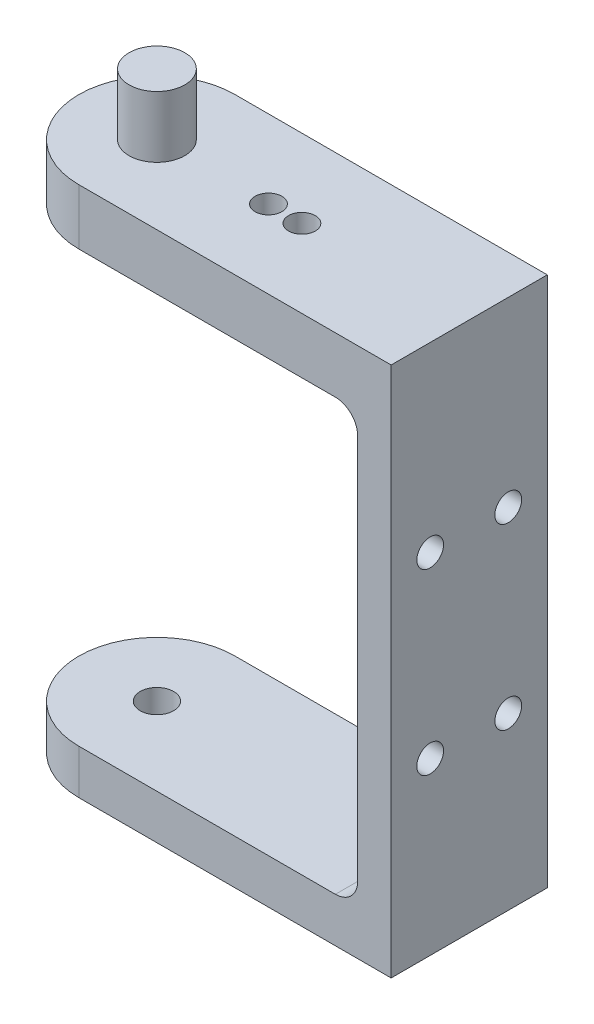
ISO-10303-21;
HEADER;
FILE_DESCRIPTION(('STEP AP214'),'2;1');
FILE_NAME('part.step','',(''),(''),'','','');
FILE_SCHEMA(('AUTOMOTIVE_DESIGN { 1 0 10303 214 1 1 1 1 }'));
ENDSEC;
DATA;
#1=APPLICATION_CONTEXT('core data for automotive mechanical design processes');
#2=APPLICATION_PROTOCOL_DEFINITION('international standard','automotive_design',2000,#1);
#3=PRODUCT_CONTEXT('',#1,'mechanical');
#4=PRODUCT('Part','Part','',(#3));
#5=PRODUCT_RELATED_PRODUCT_CATEGORY('part','',(#4));
#6=PRODUCT_DEFINITION_FORMATION('','',#4);
#7=PRODUCT_DEFINITION_CONTEXT('part definition',#1,'design');
#8=PRODUCT_DEFINITION('design','',#6,#7);
#9=PRODUCT_DEFINITION_SHAPE('','',#8);
#10=(LENGTH_UNIT() NAMED_UNIT(*) SI_UNIT(.MILLI.,.METRE.));
#11=(NAMED_UNIT(*) PLANE_ANGLE_UNIT() SI_UNIT($,.RADIAN.));
#12=(NAMED_UNIT(*) SI_UNIT($,.STERADIAN.) SOLID_ANGLE_UNIT());
#13=UNCERTAINTY_MEASURE_WITH_UNIT(LENGTH_MEASURE(1.E-05),#10,'distance_accuracy_value','');
#14=(GEOMETRIC_REPRESENTATION_CONTEXT(3) GLOBAL_UNCERTAINTY_ASSIGNED_CONTEXT((#13)) GLOBAL_UNIT_ASSIGNED_CONTEXT((#10,
#11,#12)) REPRESENTATION_CONTEXT('',''));
#15=CARTESIAN_POINT('',(0.,0.,0.));
#16=DIRECTION('',(0.,0.,1.));
#17=DIRECTION('',(1.,0.,0.));
#18=AXIS2_PLACEMENT_3D('',#15,#16,#17);
#19=CARTESIAN_POINT('',(5.5,19.3,0.));
#20=DIRECTION('',(0.,1.,0.));
#21=DIRECTION('',(0.,0.,1.));
#22=AXIS2_PLACEMENT_3D('',#19,#20,#21);
#23=PLANE('',#22);
#24=DIRECTION('',(-1.,0.,0.));
#25=VECTOR('',#24,1.);
#26=CARTESIAN_POINT('',(33.5,19.3,-7.));
#27=LINE('',#26,#25);
#28=CARTESIAN_POINT('',(28.5,19.3,-7.));
#29=VERTEX_POINT('',#28);
#30=CARTESIAN_POINT('',(5.5,19.3,-7.));
#31=VERTEX_POINT('',#30);
#32=EDGE_CURVE('E252',#29,#31,#27,.T.);
#33=ORIENTED_EDGE('',*,*,#32,.F.);
#34=DIRECTION('',(0.,0.,-1.));
#35=VECTOR('',#34,1.);
#36=CARTESIAN_POINT('',(28.5,19.3,7.));
#37=LINE('',#36,#35);
#38=CARTESIAN_POINT('',(28.5,19.3,7.));
#39=VERTEX_POINT('',#38);
#40=EDGE_CURVE('E61',#29,#39,#37,.F.);
#41=ORIENTED_EDGE('',*,*,#40,.T.);
#42=DIRECTION('',(1.,0.,0.));
#43=VECTOR('',#42,1.);
#44=CARTESIAN_POINT('',(5.5,19.3,7.));
#45=LINE('',#44,#43);
#46=CARTESIAN_POINT('',(5.5,19.3,7.));
#47=VERTEX_POINT('',#46);
#48=EDGE_CURVE('E265',#47,#39,#45,.T.);
#49=ORIENTED_EDGE('',*,*,#48,.F.);
#50=CARTESIAN_POINT('',(5.5,19.3,0.));
#51=DIRECTION('',(0.,1.,0.));
#52=DIRECTION('',(0.,0.,1.));
#53=AXIS2_PLACEMENT_3D('',#50,#51,#52);
#54=CIRCLE('',#53,7.);
#55=EDGE_CURVE('E246',#31,#47,#54,.T.);
#56=ORIENTED_EDGE('',*,*,#55,.F.);
#57=EDGE_LOOP('',(#33,#41,#49,#56));
#58=FACE_BOUND('',#57,.T.);
#59=DIRECTION('',(1.,0.,0.));
#60=VECTOR('',#59,1.);
#61=CARTESIAN_POINT('',(5.5,19.3,2.7));
#62=LINE('',#61,#60);
#63=CARTESIAN_POINT('',(8.0298221281347,19.3,2.7));
#64=VERTEX_POINT('',#63);
#65=CARTESIAN_POINT('',(20.7,19.3,2.7));
#66=VERTEX_POINT('',#65);
#67=EDGE_CURVE('E172',#64,#66,#62,.T.);
#68=ORIENTED_EDGE('',*,*,#67,.T.);
#69=DIRECTION('',(0.,0.,-1.));
#70=VECTOR('',#69,1.);
#71=CARTESIAN_POINT('',(20.7,19.3,2.7));
#72=LINE('',#71,#70);
#73=CARTESIAN_POINT('',(20.7,19.3,-2.7));
#74=VERTEX_POINT('',#73);
#75=EDGE_CURVE('E157',#66,#74,#72,.T.);
#76=ORIENTED_EDGE('',*,*,#75,.T.);
#77=DIRECTION('',(-1.,0.,0.));
#78=VECTOR('',#77,1.);
#79=CARTESIAN_POINT('',(20.7,19.3,-2.7));
#80=LINE('',#79,#78);
#81=CARTESIAN_POINT('',(8.0298221281347,19.3,-2.7));
#82=VERTEX_POINT('',#81);
#83=EDGE_CURVE('E151',#74,#82,#80,.T.);
#84=ORIENTED_EDGE('',*,*,#83,.T.);
#85=CARTESIAN_POINT('',(5.5,19.3,0.));
#86=DIRECTION('',(0.,1.,0.));
#87=DIRECTION('',(0.,0.,1.));
#88=AXIS2_PLACEMENT_3D('',#85,#86,#87);
#89=CIRCLE('',#88,3.7);
#90=EDGE_CURVE('E188',#82,#64,#89,.T.);
#91=ORIENTED_EDGE('',*,*,#90,.T.);
#92=EDGE_LOOP('',(#68,#76,#84,#91));
#93=FACE_BOUND('',#92,.T.);
#94=ADVANCED_FACE('F39',(#58,#93),#23,.F.);
#95=CARTESIAN_POINT('',(5.5,20.9,0.));
#96=DIRECTION('',(0.,-1.,0.));
#97=DIRECTION('',(0.,0.,-1.));
#98=AXIS2_PLACEMENT_3D('',#95,#96,#97);
#99=CYLINDRICAL_SURFACE('',#98,3.7);
#100=CARTESIAN_POINT('',(5.5,20.9,0.));
#101=DIRECTION('',(0.,1.,0.));
#102=DIRECTION('',(0.,0.,1.));
#103=AXIS2_PLACEMENT_3D('',#100,#101,#102);
#104=CIRCLE('',#103,3.7);
#105=CARTESIAN_POINT('',(8.02982212813471,20.9,-2.7));
#106=VERTEX_POINT('',#105);
#107=CARTESIAN_POINT('',(8.0298221281347,20.9,2.7));
#108=VERTEX_POINT('',#107);
#109=EDGE_CURVE('E189',#106,#108,#104,.T.);
#110=ORIENTED_EDGE('',*,*,#109,.T.);
#111=DIRECTION('',(0.,-1.,0.));
#112=VECTOR('',#111,1.);
#113=CARTESIAN_POINT('',(8.02982212813471,20.9,2.7));
#114=LINE('',#113,#112);
#115=EDGE_CURVE('E144',#108,#64,#114,.T.);
#116=ORIENTED_EDGE('',*,*,#115,.T.);
#117=ORIENTED_EDGE('',*,*,#90,.F.);
#118=DIRECTION('',(0.,-1.,0.));
#119=VECTOR('',#118,1.);
#120=CARTESIAN_POINT('',(8.02982212813471,20.9,-2.7));
#121=LINE('',#120,#119);
#122=EDGE_CURVE('E160',#82,#106,#121,.F.);
#123=ORIENTED_EDGE('',*,*,#122,.T.);
#124=EDGE_LOOP('',(#110,#116,#117,#123));
#125=FACE_BOUND('',#124,.T.);
#126=ADVANCED_FACE('F361',(#125),#99,.F.);
#127=CARTESIAN_POINT('',(5.5,24.3,0.));
#128=DIRECTION('',(0.,-1.,0.));
#129=DIRECTION('',(0.,0.,-1.));
#130=AXIS2_PLACEMENT_3D('',#127,#128,#129);
#131=CYLINDRICAL_SURFACE('',#130,7.);
#132=ORIENTED_EDGE('',*,*,#55,.T.);
#133=DIRECTION('',(0.,-1.,0.));
#134=VECTOR('',#133,1.);
#135=CARTESIAN_POINT('',(5.5,24.3,7.));
#136=LINE('',#135,#134);
#137=CARTESIAN_POINT('',(5.5,24.3,7.));
#138=VERTEX_POINT('',#137);
#139=EDGE_CURVE('E279',#138,#47,#136,.T.);
#140=ORIENTED_EDGE('',*,*,#139,.F.);
#141=CARTESIAN_POINT('',(5.5,24.3,0.));
#142=DIRECTION('',(0.,1.,0.));
#143=DIRECTION('',(0.,0.,1.));
#144=AXIS2_PLACEMENT_3D('',#141,#142,#143);
#145=CIRCLE('',#144,7.);
#146=CARTESIAN_POINT('',(5.5,24.3,-7.));
#147=VERTEX_POINT('',#146);
#148=EDGE_CURVE('E247',#147,#138,#145,.T.);
#149=ORIENTED_EDGE('',*,*,#148,.F.);
#150=DIRECTION('',(0.,-1.,0.));
#151=VECTOR('',#150,1.);
#152=CARTESIAN_POINT('',(5.5,24.3,-7.));
#153=LINE('',#152,#151);
#154=EDGE_CURVE('E261',#147,#31,#153,.T.);
#155=ORIENTED_EDGE('',*,*,#154,.T.);
#156=EDGE_LOOP('',(#132,#140,#149,#155));
#157=FACE_BOUND('',#156,.T.);
#158=ADVANCED_FACE('F352',(#157),#131,.T.);
#159=CARTESIAN_POINT('',(5.5,24.3,7.));
#160=DIRECTION('',(0.,0.,-1.));
#161=DIRECTION('',(-1.,0.,0.));
#162=AXIS2_PLACEMENT_3D('',#159,#160,#161);
#163=PLANE('',#162);
#164=ORIENTED_EDGE('',*,*,#48,.T.);
#165=CARTESIAN_POINT('',(28.5,17.3,7.));
#166=DIRECTION('',(0.,0.,-1.));
#167=DIRECTION('',(-1.,0.,0.));
#168=AXIS2_PLACEMENT_3D('',#165,#166,#167);
#169=CIRCLE('',#168,2.);
#170=CARTESIAN_POINT('',(30.5,17.3,7.));
#171=VERTEX_POINT('',#170);
#172=EDGE_CURVE('E11',#39,#171,#169,.T.);
#173=ORIENTED_EDGE('',*,*,#172,.T.);
#174=DIRECTION('',(0.,-1.,0.));
#175=VECTOR('',#174,1.);
#176=CARTESIAN_POINT('',(30.5,-23.3,7.));
#177=LINE('',#176,#175);
#178=CARTESIAN_POINT('',(30.5,-17.3,7.));
#179=VERTEX_POINT('',#178);
#180=EDGE_CURVE('E227',#171,#179,#177,.T.);
#181=ORIENTED_EDGE('',*,*,#180,.T.);
#182=CARTESIAN_POINT('',(28.5,-17.3,7.));
#183=DIRECTION('',(0.,0.,-1.));
#184=DIRECTION('',(-1.,0.,0.));
#185=AXIS2_PLACEMENT_3D('',#182,#183,#184);
#186=CIRCLE('',#185,2.);
#187=CARTESIAN_POINT('',(28.5,-19.3,7.));
#188=VERTEX_POINT('',#187);
#189=EDGE_CURVE('E308',#179,#188,#186,.T.);
#190=ORIENTED_EDGE('',*,*,#189,.T.);
#191=DIRECTION('',(1.,0.,0.));
#192=VECTOR('',#191,1.);
#193=CARTESIAN_POINT('',(5.5,-19.3,7.));
#194=LINE('',#193,#192);
#195=CARTESIAN_POINT('',(5.5,-19.3,7.));
#196=VERTEX_POINT('',#195);
#197=EDGE_CURVE('E208',#196,#188,#194,.T.);
#198=ORIENTED_EDGE('',*,*,#197,.F.);
#199=DIRECTION('',(0.,-1.,0.));
#200=VECTOR('',#199,1.);
#201=CARTESIAN_POINT('',(5.5,-19.3,7.));
#202=LINE('',#201,#200);
#203=CARTESIAN_POINT('',(5.5,-23.3,7.));
#204=VERTEX_POINT('',#203);
#205=EDGE_CURVE('E222',#196,#204,#202,.T.);
#206=ORIENTED_EDGE('',*,*,#205,.T.);
#207=DIRECTION('',(1.,0.,0.));
#208=VECTOR('',#207,1.);
#209=CARTESIAN_POINT('',(30.5,-23.3,7.));
#210=LINE('',#209,#208);
#211=CARTESIAN_POINT('',(33.5,-23.3,7.));
#212=VERTEX_POINT('',#211);
#213=EDGE_CURVE('E231',#204,#212,#210,.T.);
#214=ORIENTED_EDGE('',*,*,#213,.T.);
#215=DIRECTION('',(0.,-1.,0.));
#216=VECTOR('',#215,1.);
#217=CARTESIAN_POINT('',(33.5,24.3,7.));
#218=LINE('',#217,#216);
#219=CARTESIAN_POINT('',(33.5,24.3,7.));
#220=VERTEX_POINT('',#219);
#221=EDGE_CURVE('E276',#220,#212,#218,.T.);
#222=ORIENTED_EDGE('',*,*,#221,.F.);
#223=DIRECTION('',(1.,0.,0.));
#224=VECTOR('',#223,1.);
#225=CARTESIAN_POINT('',(5.5,24.3,7.));
#226=LINE('',#225,#224);
#227=EDGE_CURVE('E251',#138,#220,#226,.T.);
#228=ORIENTED_EDGE('',*,*,#227,.F.);
#229=ORIENTED_EDGE('',*,*,#139,.T.);
#230=EDGE_LOOP('',(#164,#173,#181,#190,#198,#206,#214,#222,#228,#229));
#231=FACE_BOUND('',#230,.T.);
#232=ADVANCED_FACE('F327',(#231),#163,.F.);
#233=CARTESIAN_POINT('',(33.5,24.3,7.));
#234=DIRECTION('',(-1.,0.,0.));
#235=DIRECTION('',(0.,0.,1.));
#236=AXIS2_PLACEMENT_3D('',#233,#234,#235);
#237=PLANE('',#236);
#238=CARTESIAN_POINT('',(33.5,8.,3.5));
#239=DIRECTION('',(1.,0.,0.));
#240=DIRECTION('',(0.,0.,-1.));
#241=AXIS2_PLACEMENT_3D('',#238,#239,#240);
#242=CIRCLE('',#241,1.19999999999999);
#243=CARTESIAN_POINT('',(33.5,8.,2.30000000000001));
#244=VERTEX_POINT('',#243);
#245=EDGE_CURVE('E295',#244,#244,#242,.T.);
#246=ORIENTED_EDGE('',*,*,#245,.F.);
#247=EDGE_LOOP('',(#246));
#248=FACE_BOUND('',#247,.T.);
#249=CARTESIAN_POINT('',(33.5,8.,-3.5));
#250=DIRECTION('',(1.,0.,0.));
#251=DIRECTION('',(0.,0.,-1.));
#252=AXIS2_PLACEMENT_3D('',#249,#250,#251);
#253=CIRCLE('',#252,1.19999999999999);
#254=CARTESIAN_POINT('',(33.5,8.,-4.69999999999999));
#255=VERTEX_POINT('',#254);
#256=EDGE_CURVE('E294',#255,#255,#253,.T.);
#257=ORIENTED_EDGE('',*,*,#256,.F.);
#258=EDGE_LOOP('',(#257));
#259=FACE_BOUND('',#258,.T.);
#260=CARTESIAN_POINT('',(33.5,-8.,3.5));
#261=DIRECTION('',(1.,0.,0.));
#262=DIRECTION('',(0.,0.,-1.));
#263=AXIS2_PLACEMENT_3D('',#260,#261,#262);
#264=CIRCLE('',#263,1.19999999999999);
#265=CARTESIAN_POINT('',(33.5,-8.,2.30000000000001));
#266=VERTEX_POINT('',#265);
#267=EDGE_CURVE('E647',#266,#266,#264,.T.);
#268=ORIENTED_EDGE('',*,*,#267,.F.);
#269=EDGE_LOOP('',(#268));
#270=FACE_BOUND('',#269,.T.);
#271=CARTESIAN_POINT('',(33.5,-8.,-3.5));
#272=DIRECTION('',(1.,0.,0.));
#273=DIRECTION('',(0.,0.,-1.));
#274=AXIS2_PLACEMENT_3D('',#271,#272,#273);
#275=CIRCLE('',#274,1.19999999999999);
#276=CARTESIAN_POINT('',(33.5,-8.,-4.69999999999999));
#277=VERTEX_POINT('',#276);
#278=EDGE_CURVE('E289',#277,#277,#275,.T.);
#279=ORIENTED_EDGE('',*,*,#278,.F.);
#280=EDGE_LOOP('',(#279));
#281=FACE_BOUND('',#280,.T.);
#282=ORIENTED_EDGE('',*,*,#221,.T.);
#283=DIRECTION('',(0.,0.,-1.));
#284=VECTOR('',#283,1.);
#285=CARTESIAN_POINT('',(33.5,-23.3,7.));
#286=LINE('',#285,#284);
#287=CARTESIAN_POINT('',(33.5,-23.3,-7.));
#288=VERTEX_POINT('',#287);
#289=EDGE_CURVE('E236',#212,#288,#286,.T.);
#290=ORIENTED_EDGE('',*,*,#289,.T.);
#291=DIRECTION('',(0.,-1.,0.));
#292=VECTOR('',#291,1.);
#293=CARTESIAN_POINT('',(33.5,24.3,-7.));
#294=LINE('',#293,#292);
#295=CARTESIAN_POINT('',(33.5,24.3,-7.));
#296=VERTEX_POINT('',#295);
#297=EDGE_CURVE('E273',#296,#288,#294,.T.);
#298=ORIENTED_EDGE('',*,*,#297,.F.);
#299=DIRECTION('',(0.,0.,-1.));
#300=VECTOR('',#299,1.);
#301=CARTESIAN_POINT('',(33.5,24.3,7.));
#302=LINE('',#301,#300);
#303=EDGE_CURVE('E255',#220,#296,#302,.T.);
#304=ORIENTED_EDGE('',*,*,#303,.F.);
#305=EDGE_LOOP('',(#282,#290,#298,#304));
#306=FACE_BOUND('',#305,.T.);
#307=ADVANCED_FACE('F342',(#248,#259,#270,#281,#306),#237,.F.);
#308=CARTESIAN_POINT('',(33.5,24.3,-7.));
#309=DIRECTION('',(0.,0.,1.));
#310=DIRECTION('',(1.,0.,0.));
#311=AXIS2_PLACEMENT_3D('',#308,#309,#310);
#312=PLANE('',#311);
#313=ORIENTED_EDGE('',*,*,#297,.T.);
#314=DIRECTION('',(1.,0.,0.));
#315=VECTOR('',#314,1.);
#316=CARTESIAN_POINT('',(30.5,-23.3,-7.));
#317=LINE('',#316,#315);
#318=CARTESIAN_POINT('',(5.5,-23.3,-7.));
#319=VERTEX_POINT('',#318);
#320=EDGE_CURVE('E232',#319,#288,#317,.T.);
#321=ORIENTED_EDGE('',*,*,#320,.F.);
#322=DIRECTION('',(0.,-1.,0.));
#323=VECTOR('',#322,1.);
#324=CARTESIAN_POINT('',(5.5,-19.3,-7.));
#325=LINE('',#324,#323);
#326=CARTESIAN_POINT('',(5.5,-19.3,-7.));
#327=VERTEX_POINT('',#326);
#328=EDGE_CURVE('E215',#327,#319,#325,.T.);
#329=ORIENTED_EDGE('',*,*,#328,.F.);
#330=DIRECTION('',(-1.,0.,0.));
#331=VECTOR('',#330,1.);
#332=CARTESIAN_POINT('',(33.5,-19.3,-7.));
#333=LINE('',#332,#331);
#334=CARTESIAN_POINT('',(28.5,-19.3,-7.));
#335=VERTEX_POINT('',#334);
#336=EDGE_CURVE('E212',#335,#327,#333,.T.);
#337=ORIENTED_EDGE('',*,*,#336,.F.);
#338=CARTESIAN_POINT('',(28.5,-17.3,-7.));
#339=DIRECTION('',(0.,0.,1.));
#340=DIRECTION('',(1.,0.,0.));
#341=AXIS2_PLACEMENT_3D('',#338,#339,#340);
#342=CIRCLE('',#341,2.);
#343=CARTESIAN_POINT('',(30.5,-17.3,-7.));
#344=VERTEX_POINT('',#343);
#345=EDGE_CURVE('E311',#335,#344,#342,.T.);
#346=ORIENTED_EDGE('',*,*,#345,.T.);
#347=DIRECTION('',(0.,-1.,0.));
#348=VECTOR('',#347,1.);
#349=CARTESIAN_POINT('',(30.5,-23.3,-7.));
#350=LINE('',#349,#348);
#351=CARTESIAN_POINT('',(30.5,17.3,-7.));
#352=VERTEX_POINT('',#351);
#353=EDGE_CURVE('E226',#352,#344,#350,.T.);
#354=ORIENTED_EDGE('',*,*,#353,.F.);
#355=CARTESIAN_POINT('',(28.5,17.3,-7.));
#356=DIRECTION('',(0.,0.,1.));
#357=DIRECTION('',(1.,0.,0.));
#358=AXIS2_PLACEMENT_3D('',#355,#356,#357);
#359=CIRCLE('',#358,2.);
#360=EDGE_CURVE('E48',#352,#29,#359,.T.);
#361=ORIENTED_EDGE('',*,*,#360,.T.);
#362=ORIENTED_EDGE('',*,*,#32,.T.);
#363=ORIENTED_EDGE('',*,*,#154,.F.);
#364=DIRECTION('',(-1.,0.,0.));
#365=VECTOR('',#364,1.);
#366=CARTESIAN_POINT('',(33.5,24.3,-7.));
#367=LINE('',#366,#365);
#368=EDGE_CURVE('E258',#296,#147,#367,.T.);
#369=ORIENTED_EDGE('',*,*,#368,.F.);
#370=EDGE_LOOP('',(#313,#321,#329,#337,#346,#354,#361,#362,#363,#369));
#371=FACE_BOUND('',#370,.T.);
#372=ADVANCED_FACE('F316',(#371),#312,.F.);
#373=CARTESIAN_POINT('',(5.5,24.3,0.));
#374=DIRECTION('',(0.,1.,0.));
#375=DIRECTION('',(0.,0.,1.));
#376=AXIS2_PLACEMENT_3D('',#373,#374,#375);
#377=PLANE('',#376);
#378=CARTESIAN_POINT('',(18.5,24.3,0.));
#379=DIRECTION('',(0.,1.,0.));
#380=DIRECTION('',(0.,0.,1.));
#381=AXIS2_PLACEMENT_3D('',#378,#379,#380);
#382=CIRCLE('',#381,1.19999999999999);
#383=CARTESIAN_POINT('',(18.5,24.3,1.19999999999999));
#384=VERTEX_POINT('',#383);
#385=EDGE_CURVE('E288',#384,#384,#382,.T.);
#386=ORIENTED_EDGE('',*,*,#385,.F.);
#387=EDGE_LOOP('',(#386));
#388=FACE_BOUND('',#387,.T.);
#389=CARTESIAN_POINT('',(15.5,24.3,0.));
#390=DIRECTION('',(0.,1.,0.));
#391=DIRECTION('',(0.,0.,1.));
#392=AXIS2_PLACEMENT_3D('',#389,#390,#391);
#393=CIRCLE('',#392,1.19999999999999);
#394=CARTESIAN_POINT('',(15.5,24.3,1.19999999999999));
#395=VERTEX_POINT('',#394);
#396=EDGE_CURVE('E664',#395,#395,#393,.T.);
#397=ORIENTED_EDGE('',*,*,#396,.F.);
#398=EDGE_LOOP('',(#397));
#399=FACE_BOUND('',#398,.T.);
#400=CARTESIAN_POINT('',(5.5,24.3,0.));
#401=DIRECTION('',(0.,1.,0.));
#402=DIRECTION('',(0.,0.,1.));
#403=AXIS2_PLACEMENT_3D('',#400,#401,#402);
#404=CIRCLE('',#403,2.5);
#405=CARTESIAN_POINT('',(5.5,24.3,2.5));
#406=VERTEX_POINT('',#405);
#407=EDGE_CURVE('E192',#406,#406,#404,.T.);
#408=ORIENTED_EDGE('',*,*,#407,.F.);
#409=EDGE_LOOP('',(#408));
#410=FACE_BOUND('',#409,.T.);
#411=ORIENTED_EDGE('',*,*,#368,.T.);
#412=ORIENTED_EDGE('',*,*,#148,.T.);
#413=ORIENTED_EDGE('',*,*,#227,.T.);
#414=ORIENTED_EDGE('',*,*,#303,.T.);
#415=EDGE_LOOP('',(#411,#412,#413,#414));
#416=FACE_BOUND('',#415,.T.);
#417=ADVANCED_FACE('F345',(#388,#399,#410,#416),#377,.T.);
#418=CARTESIAN_POINT('',(30.5,-23.3,7.));
#419=DIRECTION('',(1.,0.,0.));
#420=DIRECTION('',(0.,0.,-1.));
#421=AXIS2_PLACEMENT_3D('',#418,#419,#420);
#422=PLANE('',#421);
#423=CARTESIAN_POINT('',(30.5,8.,3.5));
#424=DIRECTION('',(1.,0.,0.));
#425=DIRECTION('',(0.,0.,-1.));
#426=AXIS2_PLACEMENT_3D('',#423,#424,#425);
#427=CIRCLE('',#426,1.19999999999998);
#428=CARTESIAN_POINT('',(30.5,8.,2.30000000000001));
#429=VERTEX_POINT('',#428);
#430=EDGE_CURVE('E290',#429,#429,#427,.T.);
#431=ORIENTED_EDGE('',*,*,#430,.T.);
#432=EDGE_LOOP('',(#431));
#433=FACE_BOUND('',#432,.T.);
#434=CARTESIAN_POINT('',(30.5,8.,-3.5));
#435=DIRECTION('',(1.,0.,0.));
#436=DIRECTION('',(0.,0.,-1.));
#437=AXIS2_PLACEMENT_3D('',#434,#435,#436);
#438=CIRCLE('',#437,1.19999999999998);
#439=CARTESIAN_POINT('',(30.5,8.,-4.69999999999999));
#440=VERTEX_POINT('',#439);
#441=EDGE_CURVE('E638',#440,#440,#438,.T.);
#442=ORIENTED_EDGE('',*,*,#441,.T.);
#443=EDGE_LOOP('',(#442));
#444=FACE_BOUND('',#443,.T.);
#445=CARTESIAN_POINT('',(30.5,-8.,3.5));
#446=DIRECTION('',(1.,0.,0.));
#447=DIRECTION('',(0.,0.,-1.));
#448=AXIS2_PLACEMENT_3D('',#445,#446,#447);
#449=CIRCLE('',#448,1.19999999999999);
#450=CARTESIAN_POINT('',(30.5,-8.,2.30000000000001));
#451=VERTEX_POINT('',#450);
#452=EDGE_CURVE('E642',#451,#451,#449,.T.);
#453=ORIENTED_EDGE('',*,*,#452,.T.);
#454=EDGE_LOOP('',(#453));
#455=FACE_BOUND('',#454,.T.);
#456=CARTESIAN_POINT('',(30.5,-8.,-3.5));
#457=DIRECTION('',(1.,0.,0.));
#458=DIRECTION('',(0.,0.,-1.));
#459=AXIS2_PLACEMENT_3D('',#456,#457,#458);
#460=CIRCLE('',#459,1.19999999999999);
#461=CARTESIAN_POINT('',(30.5,-8.,-4.69999999999999));
#462=VERTEX_POINT('',#461);
#463=EDGE_CURVE('E284',#462,#462,#460,.T.);
#464=ORIENTED_EDGE('',*,*,#463,.T.);
#465=EDGE_LOOP('',(#464));
#466=FACE_BOUND('',#465,.T.);
#467=ORIENTED_EDGE('',*,*,#353,.T.);
#468=DIRECTION('',(0.,0.,1.));
#469=VECTOR('',#468,1.);
#470=CARTESIAN_POINT('',(30.5,-17.3,7.));
#471=LINE('',#470,#469);
#472=EDGE_CURVE('E299',#344,#179,#471,.T.);
#473=ORIENTED_EDGE('',*,*,#472,.T.);
#474=ORIENTED_EDGE('',*,*,#180,.F.);
#475=DIRECTION('',(0.,0.,-1.));
#476=VECTOR('',#475,1.);
#477=CARTESIAN_POINT('',(30.5,17.3,-7.));
#478=LINE('',#477,#476);
#479=EDGE_CURVE('E283',#171,#352,#478,.T.);
#480=ORIENTED_EDGE('',*,*,#479,.T.);
#481=EDGE_LOOP('',(#467,#473,#474,#480));
#482=FACE_BOUND('',#481,.T.);
#483=ADVANCED_FACE('F322',(#433,#444,#455,#466,#482),#422,.F.);
#484=CARTESIAN_POINT('',(30.5,-23.3,7.));
#485=DIRECTION('',(0.,1.,0.));
#486=DIRECTION('',(0.,0.,1.));
#487=AXIS2_PLACEMENT_3D('',#484,#485,#486);
#488=PLANE('',#487);
#489=CARTESIAN_POINT('',(5.5,-23.3,0.));
#490=DIRECTION('',(0.,1.,0.));
#491=DIRECTION('',(0.,0.,1.));
#492=AXIS2_PLACEMENT_3D('',#489,#490,#491);
#493=CIRCLE('',#492,1.5);
#494=CARTESIAN_POINT('',(5.5,-23.3,1.5));
#495=VERTEX_POINT('',#494);
#496=EDGE_CURVE('E672',#495,#495,#493,.T.);
#497=ORIENTED_EDGE('',*,*,#496,.T.);
#498=EDGE_LOOP('',(#497));
#499=FACE_BOUND('',#498,.T.);
#500=ORIENTED_EDGE('',*,*,#320,.T.);
#501=ORIENTED_EDGE('',*,*,#289,.F.);
#502=ORIENTED_EDGE('',*,*,#213,.F.);
#503=CARTESIAN_POINT('',(5.5,-23.3,0.));
#504=DIRECTION('',(0.,1.,0.));
#505=DIRECTION('',(0.,0.,1.));
#506=AXIS2_PLACEMENT_3D('',#503,#504,#505);
#507=CIRCLE('',#506,7.);
#508=EDGE_CURVE('E200',#319,#204,#507,.T.);
#509=ORIENTED_EDGE('',*,*,#508,.F.);
#510=EDGE_LOOP('',(#500,#501,#502,#509));
#511=FACE_BOUND('',#510,.T.);
#512=ADVANCED_FACE('F339',(#499,#511),#488,.F.);
#513=CARTESIAN_POINT('',(5.5,-19.3,0.));
#514=DIRECTION('',(0.,1.,0.));
#515=DIRECTION('',(0.,0.,1.));
#516=AXIS2_PLACEMENT_3D('',#513,#514,#515);
#517=PLANE('',#516);
#518=CARTESIAN_POINT('',(5.5,-19.3,0.));
#519=DIRECTION('',(0.,1.,0.));
#520=DIRECTION('',(0.,0.,1.));
#521=AXIS2_PLACEMENT_3D('',#518,#519,#520);
#522=CIRCLE('',#521,1.5);
#523=CARTESIAN_POINT('',(5.5,-19.3,1.5));
#524=VERTEX_POINT('',#523);
#525=EDGE_CURVE('E673',#524,#524,#522,.T.);
#526=ORIENTED_EDGE('',*,*,#525,.F.);
#527=EDGE_LOOP('',(#526));
#528=FACE_BOUND('',#527,.T.);
#529=ORIENTED_EDGE('',*,*,#197,.T.);
#530=DIRECTION('',(0.,0.,1.));
#531=VECTOR('',#530,1.);
#532=CARTESIAN_POINT('',(28.5,-19.3,0.));
#533=LINE('',#532,#531);
#534=EDGE_CURVE('E303',#188,#335,#533,.F.);
#535=ORIENTED_EDGE('',*,*,#534,.T.);
#536=ORIENTED_EDGE('',*,*,#336,.T.);
#537=CARTESIAN_POINT('',(5.5,-19.3,0.));
#538=DIRECTION('',(0.,1.,0.));
#539=DIRECTION('',(0.,0.,1.));
#540=AXIS2_PLACEMENT_3D('',#537,#538,#539);
#541=CIRCLE('',#540,7.);
#542=EDGE_CURVE('E204',#327,#196,#541,.T.);
#543=ORIENTED_EDGE('',*,*,#542,.T.);
#544=EDGE_LOOP('',(#529,#535,#536,#543));
#545=FACE_BOUND('',#544,.T.);
#546=ADVANCED_FACE('F329',(#528,#545),#517,.T.);
#547=CARTESIAN_POINT('',(5.5,-19.3,0.));
#548=DIRECTION('',(0.,-1.,0.));
#549=DIRECTION('',(0.,0.,-1.));
#550=AXIS2_PLACEMENT_3D('',#547,#548,#549);
#551=CYLINDRICAL_SURFACE('',#550,7.);
#552=ORIENTED_EDGE('',*,*,#508,.T.);
#553=ORIENTED_EDGE('',*,*,#205,.F.);
#554=ORIENTED_EDGE('',*,*,#542,.F.);
#555=ORIENTED_EDGE('',*,*,#328,.T.);
#556=EDGE_LOOP('',(#552,#553,#554,#555));
#557=FACE_BOUND('',#556,.T.);
#558=ADVANCED_FACE('F333',(#557),#551,.T.);
#559=CARTESIAN_POINT('',(5.5,29.8,0.));
#560=DIRECTION('',(0.,-1.,0.));
#561=DIRECTION('',(0.,0.,-1.));
#562=AXIS2_PLACEMENT_3D('',#559,#560,#561);
#563=CYLINDRICAL_SURFACE('',#562,2.5);
#564=CARTESIAN_POINT('',(5.5,29.8,0.));
#565=DIRECTION('',(0.,1.,0.));
#566=DIRECTION('',(0.,0.,1.));
#567=AXIS2_PLACEMENT_3D('',#564,#565,#566);
#568=CIRCLE('',#567,2.5);
#569=CARTESIAN_POINT('',(5.5,29.8,2.5));
#570=VERTEX_POINT('',#569);
#571=EDGE_CURVE('E196',#570,#570,#568,.T.);
#572=ORIENTED_EDGE('',*,*,#571,.F.);
#573=EDGE_LOOP('',(#572));
#574=FACE_BOUND('',#573,.T.);
#575=ORIENTED_EDGE('',*,*,#407,.T.);
#576=EDGE_LOOP('',(#575));
#577=FACE_BOUND('',#576,.T.);
#578=ADVANCED_FACE('F434',(#574,#577),#563,.T.);
#579=CARTESIAN_POINT('',(5.5,29.8,0.));
#580=DIRECTION('',(0.,1.,0.));
#581=DIRECTION('',(0.,0.,1.));
#582=AXIS2_PLACEMENT_3D('',#579,#580,#581);
#583=PLANE('',#582);
#584=ORIENTED_EDGE('',*,*,#571,.T.);
#585=EDGE_LOOP('',(#584));
#586=FACE_BOUND('',#585,.T.);
#587=ADVANCED_FACE('F441',(#586),#583,.T.);
#588=CARTESIAN_POINT('',(5.5,20.9,0.));
#589=DIRECTION('',(0.,1.,0.));
#590=DIRECTION('',(0.,0.,1.));
#591=AXIS2_PLACEMENT_3D('',#588,#589,#590);
#592=PLANE('',#591);
#593=CARTESIAN_POINT('',(18.5,20.9,0.));
#594=DIRECTION('',(0.,1.,0.));
#595=DIRECTION('',(0.,0.,1.));
#596=AXIS2_PLACEMENT_3D('',#593,#594,#595);
#597=CIRCLE('',#596,1.19999999999999);
#598=CARTESIAN_POINT('',(18.5,20.9,1.19999999999999));
#599=VERTEX_POINT('',#598);
#600=EDGE_CURVE('E660',#599,#599,#597,.T.);
#601=ORIENTED_EDGE('',*,*,#600,.T.);
#602=EDGE_LOOP('',(#601));
#603=FACE_BOUND('',#602,.T.);
#604=CARTESIAN_POINT('',(15.5,20.9,0.));
#605=DIRECTION('',(0.,1.,0.));
#606=DIRECTION('',(0.,0.,1.));
#607=AXIS2_PLACEMENT_3D('',#604,#605,#606);
#608=CIRCLE('',#607,1.19999999999999);
#609=CARTESIAN_POINT('',(15.5,20.9,1.19999999999999));
#610=VERTEX_POINT('',#609);
#611=EDGE_CURVE('E668',#610,#610,#608,.T.);
#612=ORIENTED_EDGE('',*,*,#611,.T.);
#613=EDGE_LOOP('',(#612));
#614=FACE_BOUND('',#613,.T.);
#615=CARTESIAN_POINT('',(5.5,20.9,0.));
#616=DIRECTION('',(0.,1.,0.));
#617=DIRECTION('',(0.,0.,1.));
#618=AXIS2_PLACEMENT_3D('',#615,#616,#617);
#619=CIRCLE('',#618,2.5);
#620=CARTESIAN_POINT('',(5.5,20.9,2.5));
#621=VERTEX_POINT('',#620);
#622=EDGE_CURVE('E677',#621,#621,#619,.T.);
#623=ORIENTED_EDGE('',*,*,#622,.T.);
#624=EDGE_LOOP('',(#623));
#625=FACE_BOUND('',#624,.T.);
#626=ORIENTED_EDGE('',*,*,#109,.F.);
#627=DIRECTION('',(-1.,0.,0.));
#628=VECTOR('',#627,1.);
#629=CARTESIAN_POINT('',(20.7,20.9,-2.7));
#630=LINE('',#629,#628);
#631=CARTESIAN_POINT('',(20.7,20.9,-2.7));
#632=VERTEX_POINT('',#631);
#633=EDGE_CURVE('E165',#632,#106,#630,.T.);
#634=ORIENTED_EDGE('',*,*,#633,.F.);
#635=DIRECTION('',(0.,0.,-1.));
#636=VECTOR('',#635,1.);
#637=CARTESIAN_POINT('',(20.7,20.9,2.7));
#638=LINE('',#637,#636);
#639=CARTESIAN_POINT('',(20.7,20.9,2.7));
#640=VERTEX_POINT('',#639);
#641=EDGE_CURVE('E150',#640,#632,#638,.T.);
#642=ORIENTED_EDGE('',*,*,#641,.F.);
#643=DIRECTION('',(1.,0.,0.));
#644=VECTOR('',#643,1.);
#645=CARTESIAN_POINT('',(5.5,20.9,2.7));
#646=LINE('',#645,#644);
#647=EDGE_CURVE('E138',#108,#640,#646,.T.);
#648=ORIENTED_EDGE('',*,*,#647,.F.);
#649=EDGE_LOOP('',(#626,#634,#642,#648));
#650=FACE_BOUND('',#649,.T.);
#651=ADVANCED_FACE('F164',(#603,#614,#625,#650),#592,.F.);
#652=CARTESIAN_POINT('',(5.5,20.9,2.7));
#653=DIRECTION('',(0.,0.,-1.));
#654=DIRECTION('',(-1.,0.,0.));
#655=AXIS2_PLACEMENT_3D('',#652,#653,#654);
#656=PLANE('',#655);
#657=ORIENTED_EDGE('',*,*,#647,.T.);
#658=DIRECTION('',(0.,-1.,0.));
#659=VECTOR('',#658,1.);
#660=CARTESIAN_POINT('',(20.7,20.9,2.7));
#661=LINE('',#660,#659);
#662=EDGE_CURVE('E141',#640,#66,#661,.T.);
#663=ORIENTED_EDGE('',*,*,#662,.T.);
#664=ORIENTED_EDGE('',*,*,#67,.F.);
#665=ORIENTED_EDGE('',*,*,#115,.F.);
#666=EDGE_LOOP('',(#657,#663,#664,#665));
#667=FACE_BOUND('',#666,.T.);
#668=ADVANCED_FACE('F140',(#667),#656,.T.);
#669=CARTESIAN_POINT('',(20.7,20.9,2.7));
#670=DIRECTION('',(-1.,0.,0.));
#671=DIRECTION('',(0.,0.,1.));
#672=AXIS2_PLACEMENT_3D('',#669,#670,#671);
#673=PLANE('',#672);
#674=ORIENTED_EDGE('',*,*,#75,.F.);
#675=ORIENTED_EDGE('',*,*,#662,.F.);
#676=ORIENTED_EDGE('',*,*,#641,.T.);
#677=DIRECTION('',(0.,-1.,0.));
#678=VECTOR('',#677,1.);
#679=CARTESIAN_POINT('',(20.7,20.9,-2.7));
#680=LINE('',#679,#678);
#681=EDGE_CURVE('E161',#632,#74,#680,.T.);
#682=ORIENTED_EDGE('',*,*,#681,.T.);
#683=EDGE_LOOP('',(#674,#675,#676,#682));
#684=FACE_BOUND('',#683,.T.);
#685=ADVANCED_FACE('F154',(#684),#673,.T.);
#686=CARTESIAN_POINT('',(20.7,20.9,-2.7));
#687=DIRECTION('',(0.,0.,1.));
#688=DIRECTION('',(1.,0.,0.));
#689=AXIS2_PLACEMENT_3D('',#686,#687,#688);
#690=PLANE('',#689);
#691=ORIENTED_EDGE('',*,*,#83,.F.);
#692=ORIENTED_EDGE('',*,*,#681,.F.);
#693=ORIENTED_EDGE('',*,*,#633,.T.);
#694=ORIENTED_EDGE('',*,*,#122,.F.);
#695=EDGE_LOOP('',(#691,#692,#693,#694));
#696=FACE_BOUND('',#695,.T.);
#697=ADVANCED_FACE('F469',(#696),#690,.T.);
#698=CARTESIAN_POINT('',(5.5,22.5,0.));
#699=DIRECTION('',(0.,-1.,0.));
#700=DIRECTION('',(0.,0.,-1.));
#701=AXIS2_PLACEMENT_3D('',#698,#699,#700);
#702=CYLINDRICAL_SURFACE('',#701,2.5);
#703=CARTESIAN_POINT('',(5.5,22.5,0.));
#704=DIRECTION('',(0.,1.,0.));
#705=DIRECTION('',(0.,0.,1.));
#706=AXIS2_PLACEMENT_3D('',#703,#704,#705);
#707=CIRCLE('',#706,2.5);
#708=CARTESIAN_POINT('',(5.5,22.5,2.5));
#709=VERTEX_POINT('',#708);
#710=EDGE_CURVE('E175',#709,#709,#707,.T.);
#711=ORIENTED_EDGE('',*,*,#710,.T.);
#712=EDGE_LOOP('',(#711));
#713=FACE_BOUND('',#712,.T.);
#714=ORIENTED_EDGE('',*,*,#622,.F.);
#715=EDGE_LOOP('',(#714));
#716=FACE_BOUND('',#715,.T.);
#717=ADVANCED_FACE('F476',(#713,#716),#702,.F.);
#718=CARTESIAN_POINT('',(5.5,22.5,0.));
#719=DIRECTION('',(0.,1.,0.));
#720=DIRECTION('',(0.,0.,1.));
#721=AXIS2_PLACEMENT_3D('',#718,#719,#720);
#722=PLANE('',#721);
#723=ORIENTED_EDGE('',*,*,#710,.F.);
#724=EDGE_LOOP('',(#723));
#725=FACE_BOUND('',#724,.T.);
#726=ADVANCED_FACE('F484',(#725),#722,.F.);
#727=CARTESIAN_POINT('',(5.5,-19.3,0.));
#728=DIRECTION('',(0.,-1.,0.));
#729=DIRECTION('',(0.,0.,-1.));
#730=AXIS2_PLACEMENT_3D('',#727,#728,#729);
#731=CYLINDRICAL_SURFACE('',#730,1.5);
#732=ORIENTED_EDGE('',*,*,#525,.T.);
#733=EDGE_LOOP('',(#732));
#734=FACE_BOUND('',#733,.T.);
#735=ORIENTED_EDGE('',*,*,#496,.F.);
#736=EDGE_LOOP('',(#735));
#737=FACE_BOUND('',#736,.T.);
#738=ADVANCED_FACE('F491',(#734,#737),#731,.F.);
#739=CARTESIAN_POINT('',(15.5,24.3,0.));
#740=DIRECTION('',(0.,1.,0.));
#741=DIRECTION('',(0.,0.,1.));
#742=AXIS2_PLACEMENT_3D('',#739,#740,#741);
#743=CYLINDRICAL_SURFACE('',#742,1.19999999999999);
#744=ORIENTED_EDGE('',*,*,#396,.T.);
#745=EDGE_LOOP('',(#744));
#746=FACE_BOUND('',#745,.T.);
#747=ORIENTED_EDGE('',*,*,#611,.F.);
#748=EDGE_LOOP('',(#747));
#749=FACE_BOUND('',#748,.T.);
#750=ADVANCED_FACE('F498',(#746,#749),#743,.F.);
#751=CARTESIAN_POINT('',(18.5,24.3,0.));
#752=DIRECTION('',(0.,1.,0.));
#753=DIRECTION('',(0.,0.,1.));
#754=AXIS2_PLACEMENT_3D('',#751,#752,#753);
#755=CYLINDRICAL_SURFACE('',#754,1.19999999999999);
#756=ORIENTED_EDGE('',*,*,#385,.T.);
#757=EDGE_LOOP('',(#756));
#758=FACE_BOUND('',#757,.T.);
#759=ORIENTED_EDGE('',*,*,#600,.F.);
#760=EDGE_LOOP('',(#759));
#761=FACE_BOUND('',#760,.T.);
#762=ADVANCED_FACE('F505',(#758,#761),#755,.F.);
#763=CARTESIAN_POINT('',(33.5,-8.,-3.5));
#764=DIRECTION('',(1.,0.,0.));
#765=DIRECTION('',(0.,0.,-1.));
#766=AXIS2_PLACEMENT_3D('',#763,#764,#765);
#767=CYLINDRICAL_SURFACE('',#766,1.19999999999999);
#768=ORIENTED_EDGE('',*,*,#278,.T.);
#769=EDGE_LOOP('',(#768));
#770=FACE_BOUND('',#769,.T.);
#771=ORIENTED_EDGE('',*,*,#463,.F.);
#772=EDGE_LOOP('',(#771));
#773=FACE_BOUND('',#772,.T.);
#774=ADVANCED_FACE('F512',(#770,#773),#767,.F.);
#775=CARTESIAN_POINT('',(33.5,-8.,3.5));
#776=DIRECTION('',(1.,0.,0.));
#777=DIRECTION('',(0.,0.,-1.));
#778=AXIS2_PLACEMENT_3D('',#775,#776,#777);
#779=CYLINDRICAL_SURFACE('',#778,1.19999999999999);
#780=ORIENTED_EDGE('',*,*,#267,.T.);
#781=EDGE_LOOP('',(#780));
#782=FACE_BOUND('',#781,.T.);
#783=ORIENTED_EDGE('',*,*,#452,.F.);
#784=EDGE_LOOP('',(#783));
#785=FACE_BOUND('',#784,.T.);
#786=ADVANCED_FACE('F520',(#782,#785),#779,.F.);
#787=CARTESIAN_POINT('',(33.5,8.,-3.5));
#788=DIRECTION('',(1.,0.,0.));
#789=DIRECTION('',(0.,0.,-1.));
#790=AXIS2_PLACEMENT_3D('',#787,#788,#789);
#791=CYLINDRICAL_SURFACE('',#790,1.19999999999998);
#792=ORIENTED_EDGE('',*,*,#256,.T.);
#793=EDGE_LOOP('',(#792));
#794=FACE_BOUND('',#793,.T.);
#795=ORIENTED_EDGE('',*,*,#441,.F.);
#796=EDGE_LOOP('',(#795));
#797=FACE_BOUND('',#796,.T.);
#798=ADVANCED_FACE('F528',(#794,#797),#791,.F.);
#799=CARTESIAN_POINT('',(33.5,8.,3.5));
#800=DIRECTION('',(1.,0.,0.));
#801=DIRECTION('',(0.,0.,-1.));
#802=AXIS2_PLACEMENT_3D('',#799,#800,#801);
#803=CYLINDRICAL_SURFACE('',#802,1.19999999999998);
#804=ORIENTED_EDGE('',*,*,#245,.T.);
#805=EDGE_LOOP('',(#804));
#806=FACE_BOUND('',#805,.T.);
#807=ORIENTED_EDGE('',*,*,#430,.F.);
#808=EDGE_LOOP('',(#807));
#809=FACE_BOUND('',#808,.T.);
#810=ADVANCED_FACE('F359',(#806,#809),#803,.F.);
#811=CARTESIAN_POINT('',(28.5,-17.3,7.));
#812=DIRECTION('',(0.,0.,1.));
#813=DIRECTION('',(1.,0.,0.));
#814=AXIS2_PLACEMENT_3D('',#811,#812,#813);
#815=CYLINDRICAL_SURFACE('',#814,2.);
#816=ORIENTED_EDGE('',*,*,#345,.F.);
#817=ORIENTED_EDGE('',*,*,#534,.F.);
#818=ORIENTED_EDGE('',*,*,#189,.F.);
#819=ORIENTED_EDGE('',*,*,#472,.F.);
#820=EDGE_LOOP('',(#816,#817,#818,#819));
#821=FACE_BOUND('',#820,.T.);
#822=ADVANCED_FACE('F325',(#821),#815,.F.);
#823=CARTESIAN_POINT('',(28.5,17.3,7.));
#824=DIRECTION('',(0.,0.,1.));
#825=DIRECTION('',(1.,0.,0.));
#826=AXIS2_PLACEMENT_3D('',#823,#824,#825);
#827=CYLINDRICAL_SURFACE('',#826,2.);
#828=ORIENTED_EDGE('',*,*,#172,.F.);
#829=ORIENTED_EDGE('',*,*,#40,.F.);
#830=ORIENTED_EDGE('',*,*,#360,.F.);
#831=ORIENTED_EDGE('',*,*,#479,.F.);
#832=EDGE_LOOP('',(#828,#829,#830,#831));
#833=FACE_BOUND('',#832,.T.);
#834=ADVANCED_FACE('F41',(#833),#827,.F.);
#835=CLOSED_SHELL('',(#94,#126,#158,#232,#307,#372,#417,#483,#512,#546,#558,#578,#587,#651,#668,
#685,#697,#717,#726,#738,#750,#762,#774,#786,#798,#810,#822,#834));
#836=MANIFOLD_SOLID_BREP('B2',#835);
#837=ADVANCED_BREP_SHAPE_REPRESENTATION('',(#18,#836),#14);
#838=SHAPE_DEFINITION_REPRESENTATION(#9,#837);
ENDSEC;
END-ISO-10303-21;
